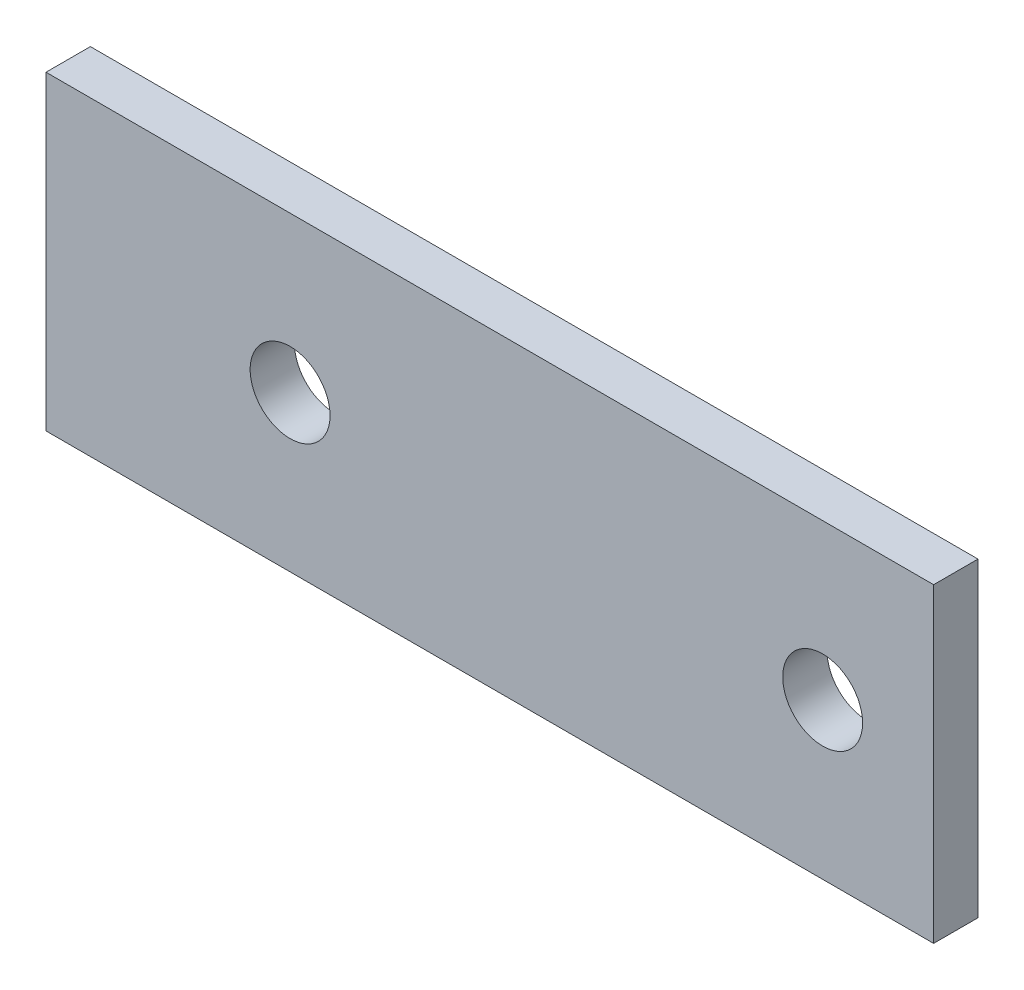
ISO-10303-21;
HEADER;
FILE_DESCRIPTION(('STEP AP214'),'2;1');
FILE_NAME('part.step','',(''),(''),'','','');
FILE_SCHEMA(('AUTOMOTIVE_DESIGN { 1 0 10303 214 1 1 1 1 }'));
ENDSEC;
DATA;
#1=APPLICATION_CONTEXT('core data for automotive mechanical design processes');
#2=APPLICATION_PROTOCOL_DEFINITION('international standard','automotive_design',2000,#1);
#3=PRODUCT_CONTEXT('',#1,'mechanical');
#4=PRODUCT('Part','Part','',(#3));
#5=PRODUCT_RELATED_PRODUCT_CATEGORY('part','',(#4));
#6=PRODUCT_DEFINITION_FORMATION('','',#4);
#7=PRODUCT_DEFINITION_CONTEXT('part definition',#1,'design');
#8=PRODUCT_DEFINITION('design','',#6,#7);
#9=PRODUCT_DEFINITION_SHAPE('','',#8);
#10=(LENGTH_UNIT() NAMED_UNIT(*) SI_UNIT(.MILLI.,.METRE.));
#11=(NAMED_UNIT(*) PLANE_ANGLE_UNIT() SI_UNIT($,.RADIAN.));
#12=(NAMED_UNIT(*) SI_UNIT($,.STERADIAN.) SOLID_ANGLE_UNIT());
#13=UNCERTAINTY_MEASURE_WITH_UNIT(LENGTH_MEASURE(1.E-05),#10,'distance_accuracy_value','');
#14=(GEOMETRIC_REPRESENTATION_CONTEXT(3) GLOBAL_UNCERTAINTY_ASSIGNED_CONTEXT((#13)) GLOBAL_UNIT_ASSIGNED_CONTEXT((#10,
#11,#12)) REPRESENTATION_CONTEXT('',''));
#15=CARTESIAN_POINT('',(0.,0.,0.));
#16=DIRECTION('',(0.,0.,1.));
#17=DIRECTION('',(1.,0.,0.));
#18=AXIS2_PLACEMENT_3D('',#15,#16,#17);
#19=CARTESIAN_POINT('',(0.,0.,5.));
#20=DIRECTION('',(0.,0.,1.));
#21=DIRECTION('',(1.,0.,0.));
#22=AXIS2_PLACEMENT_3D('',#19,#20,#21);
#23=PLANE('',#22);
#24=CARTESIAN_POINT('',(75.,0.,5.));
#25=DIRECTION('',(0.,0.,1.));
#26=DIRECTION('',(1.,0.,0.));
#27=AXIS2_PLACEMENT_3D('',#24,#25,#26);
#28=CIRCLE('',#27,9.);
#29=CARTESIAN_POINT('',(84.,0.,5.));
#30=VERTEX_POINT('',#29);
#31=EDGE_CURVE('E108',#30,#30,#28,.T.);
#32=ORIENTED_EDGE('',*,*,#31,.F.);
#33=EDGE_LOOP('',(#32));
#34=FACE_BOUND('',#33,.T.);
#35=DIRECTION('',(0.,1.,0.));
#36=VECTOR('',#35,1.);
#37=CARTESIAN_POINT('',(100.,35.,5.));
#38=LINE('',#37,#36);
#39=CARTESIAN_POINT('',(100.,-35.,5.));
#40=VERTEX_POINT('',#39);
#41=CARTESIAN_POINT('',(100.,35.,5.));
#42=VERTEX_POINT('',#41);
#43=EDGE_CURVE('E87',#40,#42,#38,.T.);
#44=ORIENTED_EDGE('',*,*,#43,.T.);
#45=DIRECTION('',(-1.,0.,0.));
#46=VECTOR('',#45,1.);
#47=CARTESIAN_POINT('',(-100.,35.,5.));
#48=LINE('',#47,#46);
#49=CARTESIAN_POINT('',(-100.,35.,5.));
#50=VERTEX_POINT('',#49);
#51=EDGE_CURVE('E82',#42,#50,#48,.T.);
#52=ORIENTED_EDGE('',*,*,#51,.T.);
#53=DIRECTION('',(0.,-1.,0.));
#54=VECTOR('',#53,1.);
#55=CARTESIAN_POINT('',(-100.,35.,5.));
#56=LINE('',#55,#54);
#57=CARTESIAN_POINT('',(-100.,-35.,5.));
#58=VERTEX_POINT('',#57);
#59=EDGE_CURVE('E85',#50,#58,#56,.T.);
#60=ORIENTED_EDGE('',*,*,#59,.T.);
#61=DIRECTION('',(1.,0.,0.));
#62=VECTOR('',#61,1.);
#63=CARTESIAN_POINT('',(-100.,-35.,5.));
#64=LINE('',#63,#62);
#65=EDGE_CURVE('E52',#58,#40,#64,.T.);
#66=ORIENTED_EDGE('',*,*,#65,.T.);
#67=EDGE_LOOP('',(#44,#52,#60,#66));
#68=FACE_BOUND('',#67,.T.);
#69=CARTESIAN_POINT('',(-45.,0.,5.));
#70=DIRECTION('',(0.,0.,1.));
#71=DIRECTION('',(1.,0.,0.));
#72=AXIS2_PLACEMENT_3D('',#69,#70,#71);
#73=CIRCLE('',#72,9.);
#74=CARTESIAN_POINT('',(-36.,0.,5.));
#75=VERTEX_POINT('',#74);
#76=EDGE_CURVE('E132',#75,#75,#73,.T.);
#77=ORIENTED_EDGE('',*,*,#76,.F.);
#78=EDGE_LOOP('',(#77));
#79=FACE_BOUND('',#78,.T.);
#80=ADVANCED_FACE('F34',(#34,#68,#79),#23,.T.);
#81=CARTESIAN_POINT('',(0.,0.,-5.));
#82=DIRECTION('',(0.,0.,1.));
#83=DIRECTION('',(1.,0.,0.));
#84=AXIS2_PLACEMENT_3D('',#81,#82,#83);
#85=PLANE('',#84);
#86=DIRECTION('',(0.,1.,0.));
#87=VECTOR('',#86,1.);
#88=CARTESIAN_POINT('',(100.,35.,-5.));
#89=LINE('',#88,#87);
#90=CARTESIAN_POINT('',(100.,-35.,-5.));
#91=VERTEX_POINT('',#90);
#92=CARTESIAN_POINT('',(100.,35.,-5.));
#93=VERTEX_POINT('',#92);
#94=EDGE_CURVE('E104',#91,#93,#89,.T.);
#95=ORIENTED_EDGE('',*,*,#94,.F.);
#96=DIRECTION('',(1.,0.,0.));
#97=VECTOR('',#96,1.);
#98=CARTESIAN_POINT('',(-100.,-35.,-5.));
#99=LINE('',#98,#97);
#100=CARTESIAN_POINT('',(-100.,-35.,-5.));
#101=VERTEX_POINT('',#100);
#102=EDGE_CURVE('E75',#101,#91,#99,.T.);
#103=ORIENTED_EDGE('',*,*,#102,.F.);
#104=DIRECTION('',(0.,-1.,0.));
#105=VECTOR('',#104,1.);
#106=CARTESIAN_POINT('',(-100.,35.,-5.));
#107=LINE('',#106,#105);
#108=CARTESIAN_POINT('',(-100.,35.,-5.));
#109=VERTEX_POINT('',#108);
#110=EDGE_CURVE('E69',#109,#101,#107,.T.);
#111=ORIENTED_EDGE('',*,*,#110,.F.);
#112=DIRECTION('',(-1.,0.,0.));
#113=VECTOR('',#112,1.);
#114=CARTESIAN_POINT('',(-100.,35.,-5.));
#115=LINE('',#114,#113);
#116=EDGE_CURVE('E92',#93,#109,#115,.T.);
#117=ORIENTED_EDGE('',*,*,#116,.F.);
#118=EDGE_LOOP('',(#95,#103,#111,#117));
#119=FACE_BOUND('',#118,.T.);
#120=CARTESIAN_POINT('',(75.,0.,-5.));
#121=DIRECTION('',(0.,0.,1.));
#122=DIRECTION('',(1.,0.,0.));
#123=AXIS2_PLACEMENT_3D('',#120,#121,#122);
#124=CIRCLE('',#123,9.);
#125=CARTESIAN_POINT('',(84.,0.,-5.));
#126=VERTEX_POINT('',#125);
#127=EDGE_CURVE('E128',#126,#126,#124,.T.);
#128=ORIENTED_EDGE('',*,*,#127,.T.);
#129=EDGE_LOOP('',(#128));
#130=FACE_BOUND('',#129,.T.);
#131=CARTESIAN_POINT('',(-45.,0.,-5.));
#132=DIRECTION('',(0.,0.,1.));
#133=DIRECTION('',(1.,0.,0.));
#134=AXIS2_PLACEMENT_3D('',#131,#132,#133);
#135=CIRCLE('',#134,9.);
#136=CARTESIAN_POINT('',(-36.,0.,-5.));
#137=VERTEX_POINT('',#136);
#138=EDGE_CURVE('E136',#137,#137,#135,.T.);
#139=ORIENTED_EDGE('',*,*,#138,.T.);
#140=EDGE_LOOP('',(#139));
#141=FACE_BOUND('',#140,.T.);
#142=ADVANCED_FACE('F122',(#119,#130,#141),#85,.F.);
#143=CARTESIAN_POINT('',(100.,35.,5.));
#144=DIRECTION('',(-1.,0.,0.));
#145=DIRECTION('',(0.,0.,1.));
#146=AXIS2_PLACEMENT_3D('',#143,#144,#145);
#147=PLANE('',#146);
#148=ORIENTED_EDGE('',*,*,#94,.T.);
#149=DIRECTION('',(0.,0.,-1.));
#150=VECTOR('',#149,1.);
#151=CARTESIAN_POINT('',(100.,35.,5.));
#152=LINE('',#151,#150);
#153=EDGE_CURVE('E11',#42,#93,#152,.T.);
#154=ORIENTED_EDGE('',*,*,#153,.F.);
#155=ORIENTED_EDGE('',*,*,#43,.F.);
#156=DIRECTION('',(0.,0.,-1.));
#157=VECTOR('',#156,1.);
#158=CARTESIAN_POINT('',(100.,-35.,5.));
#159=LINE('',#158,#157);
#160=EDGE_CURVE('E100',#40,#91,#159,.T.);
#161=ORIENTED_EDGE('',*,*,#160,.T.);
#162=EDGE_LOOP('',(#148,#154,#155,#161));
#163=FACE_BOUND('',#162,.T.);
#164=ADVANCED_FACE('F36',(#163),#147,.F.);
#165=CARTESIAN_POINT('',(-100.,35.,5.));
#166=DIRECTION('',(0.,-1.,0.));
#167=DIRECTION('',(0.,0.,-1.));
#168=AXIS2_PLACEMENT_3D('',#165,#166,#167);
#169=PLANE('',#168);
#170=ORIENTED_EDGE('',*,*,#116,.T.);
#171=DIRECTION('',(0.,0.,-1.));
#172=VECTOR('',#171,1.);
#173=CARTESIAN_POINT('',(-100.,35.,5.));
#174=LINE('',#173,#172);
#175=EDGE_CURVE('E44',#50,#109,#174,.T.);
#176=ORIENTED_EDGE('',*,*,#175,.F.);
#177=ORIENTED_EDGE('',*,*,#51,.F.);
#178=ORIENTED_EDGE('',*,*,#153,.T.);
#179=EDGE_LOOP('',(#170,#176,#177,#178));
#180=FACE_BOUND('',#179,.T.);
#181=ADVANCED_FACE('F91',(#180),#169,.F.);
#182=CARTESIAN_POINT('',(-100.,35.,5.));
#183=DIRECTION('',(1.,0.,0.));
#184=DIRECTION('',(0.,0.,-1.));
#185=AXIS2_PLACEMENT_3D('',#182,#183,#184);
#186=PLANE('',#185);
#187=ORIENTED_EDGE('',*,*,#110,.T.);
#188=DIRECTION('',(0.,0.,-1.));
#189=VECTOR('',#188,1.);
#190=CARTESIAN_POINT('',(-100.,-35.,5.));
#191=LINE('',#190,#189);
#192=EDGE_CURVE('E94',#58,#101,#191,.T.);
#193=ORIENTED_EDGE('',*,*,#192,.F.);
#194=ORIENTED_EDGE('',*,*,#59,.F.);
#195=ORIENTED_EDGE('',*,*,#175,.T.);
#196=EDGE_LOOP('',(#187,#193,#194,#195));
#197=FACE_BOUND('',#196,.T.);
#198=ADVANCED_FACE('F95',(#197),#186,.F.);
#199=CARTESIAN_POINT('',(-100.,-35.,5.));
#200=DIRECTION('',(0.,1.,0.));
#201=DIRECTION('',(0.,0.,1.));
#202=AXIS2_PLACEMENT_3D('',#199,#200,#201);
#203=PLANE('',#202);
#204=ORIENTED_EDGE('',*,*,#102,.T.);
#205=ORIENTED_EDGE('',*,*,#160,.F.);
#206=ORIENTED_EDGE('',*,*,#65,.F.);
#207=ORIENTED_EDGE('',*,*,#192,.T.);
#208=EDGE_LOOP('',(#204,#205,#206,#207));
#209=FACE_BOUND('',#208,.T.);
#210=ADVANCED_FACE('F119',(#209),#203,.F.);
#211=CARTESIAN_POINT('',(75.,0.,5.));
#212=DIRECTION('',(0.,0.,-1.));
#213=DIRECTION('',(-1.,0.,0.));
#214=AXIS2_PLACEMENT_3D('',#211,#212,#213);
#215=CYLINDRICAL_SURFACE('',#214,9.);
#216=ORIENTED_EDGE('',*,*,#31,.T.);
#217=EDGE_LOOP('',(#216));
#218=FACE_BOUND('',#217,.T.);
#219=ORIENTED_EDGE('',*,*,#127,.F.);
#220=EDGE_LOOP('',(#219));
#221=FACE_BOUND('',#220,.T.);
#222=ADVANCED_FACE('F156',(#218,#221),#215,.F.);
#223=CARTESIAN_POINT('',(-45.,0.,5.));
#224=DIRECTION('',(0.,0.,-1.));
#225=DIRECTION('',(-1.,0.,0.));
#226=AXIS2_PLACEMENT_3D('',#223,#224,#225);
#227=CYLINDRICAL_SURFACE('',#226,9.);
#228=ORIENTED_EDGE('',*,*,#76,.T.);
#229=EDGE_LOOP('',(#228));
#230=FACE_BOUND('',#229,.T.);
#231=ORIENTED_EDGE('',*,*,#138,.F.);
#232=EDGE_LOOP('',(#231));
#233=FACE_BOUND('',#232,.T.);
#234=ADVANCED_FACE('F145',(#230,#233),#227,.F.);
#235=CLOSED_SHELL('',(#80,#142,#164,#181,#198,#210,#222,#234));
#236=MANIFOLD_SOLID_BREP('B2',#235);
#237=ADVANCED_BREP_SHAPE_REPRESENTATION('',(#18,#236),#14);
#238=SHAPE_DEFINITION_REPRESENTATION(#9,#237);
ENDSEC;
END-ISO-10303-21;
